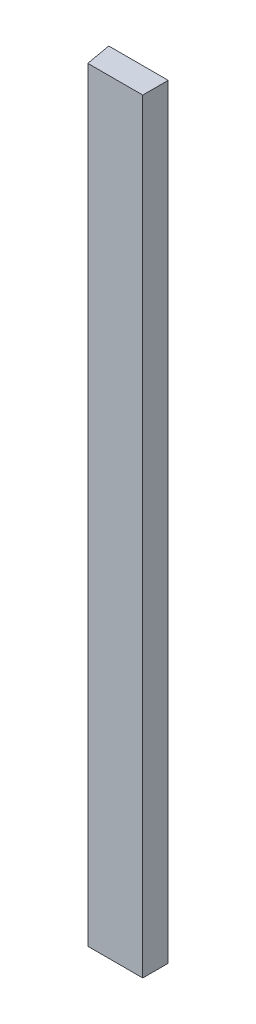
ISO-10303-21;
HEADER;
FILE_DESCRIPTION(('STEP AP214'),'2;1');
FILE_NAME('part.step','',(''),(''),'','','');
FILE_SCHEMA(('AUTOMOTIVE_DESIGN { 1 0 10303 214 1 1 1 1 }'));
ENDSEC;
DATA;
#1=APPLICATION_CONTEXT('core data for automotive mechanical design processes');
#2=APPLICATION_PROTOCOL_DEFINITION('international standard','automotive_design',2000,#1);
#3=PRODUCT_CONTEXT('',#1,'mechanical');
#4=PRODUCT('Part','Part','',(#3));
#5=PRODUCT_RELATED_PRODUCT_CATEGORY('part','',(#4));
#6=PRODUCT_DEFINITION_FORMATION('','',#4);
#7=PRODUCT_DEFINITION_CONTEXT('part definition',#1,'design');
#8=PRODUCT_DEFINITION('design','',#6,#7);
#9=PRODUCT_DEFINITION_SHAPE('','',#8);
#10=(LENGTH_UNIT() NAMED_UNIT(*) SI_UNIT(.MILLI.,.METRE.));
#11=(NAMED_UNIT(*) PLANE_ANGLE_UNIT() SI_UNIT($,.RADIAN.));
#12=(NAMED_UNIT(*) SI_UNIT($,.STERADIAN.) SOLID_ANGLE_UNIT());
#13=UNCERTAINTY_MEASURE_WITH_UNIT(LENGTH_MEASURE(1.E-05),#10,'distance_accuracy_value','');
#14=(GEOMETRIC_REPRESENTATION_CONTEXT(3) GLOBAL_UNCERTAINTY_ASSIGNED_CONTEXT((#13)) GLOBAL_UNIT_ASSIGNED_CONTEXT((#10,
#11,#12)) REPRESENTATION_CONTEXT('',''));
#15=CARTESIAN_POINT('',(0.,0.,0.));
#16=DIRECTION('',(0.,0.,1.));
#17=DIRECTION('',(1.,0.,0.));
#18=AXIS2_PLACEMENT_3D('',#15,#16,#17);
#19=CARTESIAN_POINT('',(44.4500000000001,1143.,-19.05));
#20=DIRECTION('',(-1.,0.,0.));
#21=DIRECTION('',(0.,0.,1.));
#22=AXIS2_PLACEMENT_3D('',#19,#20,#21);
#23=PLANE('',#22);
#24=DIRECTION('',(0.,0.,-1.));
#25=VECTOR('',#24,1.);
#26=CARTESIAN_POINT('',(44.4500000000001,8.88178419700125E-13,-19.0500000000009));
#27=LINE('',#26,#25);
#28=CARTESIAN_POINT('',(44.4500000000001,8.88178419700125E-13,19.0499999999991));
#29=VERTEX_POINT('',#28);
#30=CARTESIAN_POINT('',(44.4500000000001,8.88178419700125E-13,-19.0500000000009));
#31=VERTEX_POINT('',#30);
#32=EDGE_CURVE('E91',#29,#31,#27,.T.);
#33=ORIENTED_EDGE('',*,*,#32,.T.);
#34=DIRECTION('',(0.,-1.,0.));
#35=VECTOR('',#34,1.);
#36=CARTESIAN_POINT('',(44.4500000000001,1143.,-19.05));
#37=LINE('',#36,#35);
#38=CARTESIAN_POINT('',(44.4500000000001,1143.,-19.05));
#39=VERTEX_POINT('',#38);
#40=EDGE_CURVE('E11',#39,#31,#37,.T.);
#41=ORIENTED_EDGE('',*,*,#40,.F.);
#42=DIRECTION('',(0.,0.,-1.));
#43=VECTOR('',#42,1.);
#44=CARTESIAN_POINT('',(44.4500000000001,1143.,-19.05));
#45=LINE('',#44,#43);
#46=CARTESIAN_POINT('',(44.4500000000001,1143.,19.05));
#47=VERTEX_POINT('',#46);
#48=EDGE_CURVE('E79',#47,#39,#45,.T.);
#49=ORIENTED_EDGE('',*,*,#48,.F.);
#50=DIRECTION('',(0.,-1.,0.));
#51=VECTOR('',#50,1.);
#52=CARTESIAN_POINT('',(44.4500000000001,1143.,19.05));
#53=LINE('',#52,#51);
#54=EDGE_CURVE('E87',#47,#29,#53,.T.);
#55=ORIENTED_EDGE('',*,*,#54,.T.);
#56=EDGE_LOOP('',(#33,#41,#49,#55));
#57=FACE_BOUND('',#56,.T.);
#58=ADVANCED_FACE('F28',(#57),#23,.F.);
#59=CARTESIAN_POINT('',(44.4500000000001,1143.,-19.05));
#60=DIRECTION('',(0.,0.,1.));
#61=DIRECTION('',(1.,0.,0.));
#62=AXIS2_PLACEMENT_3D('',#59,#60,#61);
#63=PLANE('',#62);
#64=DIRECTION('',(-1.,0.,0.));
#65=VECTOR('',#64,1.);
#66=CARTESIAN_POINT('',(44.4500000000001,8.88178419700125E-13,-19.0500000000009));
#67=LINE('',#66,#65);
#68=CARTESIAN_POINT('',(-44.4500000000001,0.,-19.05));
#69=VERTEX_POINT('',#68);
#70=EDGE_CURVE('E83',#31,#69,#67,.T.);
#71=ORIENTED_EDGE('',*,*,#70,.T.);
#72=DIRECTION('',(0.,-1.,0.));
#73=VECTOR('',#72,1.);
#74=CARTESIAN_POINT('',(-44.4499999999999,1143.,-19.05));
#75=LINE('',#74,#73);
#76=CARTESIAN_POINT('',(-44.4499999999999,1143.,-19.05));
#77=VERTEX_POINT('',#76);
#78=EDGE_CURVE('E36',#77,#69,#75,.T.);
#79=ORIENTED_EDGE('',*,*,#78,.F.);
#80=DIRECTION('',(-1.,0.,0.));
#81=VECTOR('',#80,1.);
#82=CARTESIAN_POINT('',(44.4500000000001,1143.,-19.05));
#83=LINE('',#82,#81);
#84=EDGE_CURVE('E74',#39,#77,#83,.T.);
#85=ORIENTED_EDGE('',*,*,#84,.F.);
#86=ORIENTED_EDGE('',*,*,#40,.T.);
#87=EDGE_LOOP('',(#71,#79,#85,#86));
#88=FACE_BOUND('',#87,.T.);
#89=ADVANCED_FACE('F82',(#88),#63,.F.);
#90=CARTESIAN_POINT('',(-44.4499999999999,1143.,-19.05));
#91=DIRECTION('',(0.984807753012207,0.,-0.173648177666935));
#92=DIRECTION('',(-0.173648177666935,0.,-0.984807753012207));
#93=AXIS2_PLACEMENT_3D('',#90,#91,#92);
#94=PLANE('',#93);
#95=DIRECTION('',(0.173648177666935,0.,0.984807753012207));
#96=VECTOR('',#95,1.);
#97=CARTESIAN_POINT('',(-44.4500000000001,0.,-19.05));
#98=LINE('',#97,#96);
#99=CARTESIAN_POINT('',(-37.7319420350073,0.,19.05));
#100=VERTEX_POINT('',#99);
#101=EDGE_CURVE('E61',#69,#100,#98,.T.);
#102=ORIENTED_EDGE('',*,*,#101,.T.);
#103=DIRECTION('',(0.,-1.,0.));
#104=VECTOR('',#103,1.);
#105=CARTESIAN_POINT('',(-37.7319420350073,1143.,19.05));
#106=LINE('',#105,#104);
#107=CARTESIAN_POINT('',(-37.7319420350073,1143.,19.05));
#108=VERTEX_POINT('',#107);
#109=EDGE_CURVE('E84',#108,#100,#106,.T.);
#110=ORIENTED_EDGE('',*,*,#109,.F.);
#111=DIRECTION('',(0.173648177666935,0.,0.984807753012207));
#112=VECTOR('',#111,1.);
#113=CARTESIAN_POINT('',(-44.4499999999999,1143.,-19.05));
#114=LINE('',#113,#112);
#115=EDGE_CURVE('E77',#77,#108,#114,.T.);
#116=ORIENTED_EDGE('',*,*,#115,.F.);
#117=ORIENTED_EDGE('',*,*,#78,.T.);
#118=EDGE_LOOP('',(#102,#110,#116,#117));
#119=FACE_BOUND('',#118,.T.);
#120=ADVANCED_FACE('F85',(#119),#94,.F.);
#121=CARTESIAN_POINT('',(44.4500000000001,1143.,19.05));
#122=DIRECTION('',(0.,0.,-1.));
#123=DIRECTION('',(-1.,0.,0.));
#124=AXIS2_PLACEMENT_3D('',#121,#122,#123);
#125=PLANE('',#124);
#126=DIRECTION('',(1.,0.,0.));
#127=VECTOR('',#126,1.);
#128=CARTESIAN_POINT('',(44.4500000000001,8.88178419700125E-13,19.0499999999991));
#129=LINE('',#128,#127);
#130=EDGE_CURVE('E67',#100,#29,#129,.T.);
#131=ORIENTED_EDGE('',*,*,#130,.T.);
#132=ORIENTED_EDGE('',*,*,#54,.F.);
#133=DIRECTION('',(1.,0.,0.));
#134=VECTOR('',#133,1.);
#135=CARTESIAN_POINT('',(44.4500000000001,1143.,19.05));
#136=LINE('',#135,#134);
#137=EDGE_CURVE('E44',#108,#47,#136,.T.);
#138=ORIENTED_EDGE('',*,*,#137,.F.);
#139=ORIENTED_EDGE('',*,*,#109,.T.);
#140=EDGE_LOOP('',(#131,#132,#138,#139));
#141=FACE_BOUND('',#140,.T.);
#142=ADVANCED_FACE('F98',(#141),#125,.F.);
#143=CARTESIAN_POINT('',(0.,1143.,0.));
#144=DIRECTION('',(0.,-1.,0.));
#145=DIRECTION('',(0.,0.,-1.));
#146=AXIS2_PLACEMENT_3D('',#143,#144,#145);
#147=PLANE('',#146);
#148=ORIENTED_EDGE('',*,*,#48,.T.);
#149=ORIENTED_EDGE('',*,*,#84,.T.);
#150=ORIENTED_EDGE('',*,*,#115,.T.);
#151=ORIENTED_EDGE('',*,*,#137,.T.);
#152=EDGE_LOOP('',(#148,#149,#150,#151));
#153=FACE_BOUND('',#152,.T.);
#154=ADVANCED_FACE('F75',(#153),#147,.F.);
#155=CARTESIAN_POINT('',(0.,0.,0.));
#156=DIRECTION('',(0.,-1.,0.));
#157=DIRECTION('',(0.,0.,-1.));
#158=AXIS2_PLACEMENT_3D('',#155,#156,#157);
#159=PLANE('',#158);
#160=ORIENTED_EDGE('',*,*,#32,.F.);
#161=ORIENTED_EDGE('',*,*,#130,.F.);
#162=ORIENTED_EDGE('',*,*,#101,.F.);
#163=ORIENTED_EDGE('',*,*,#70,.F.);
#164=EDGE_LOOP('',(#160,#161,#162,#163));
#165=FACE_BOUND('',#164,.T.);
#166=ADVANCED_FACE('F101',(#165),#159,.T.);
#167=CLOSED_SHELL('',(#58,#89,#120,#142,#154,#166));
#168=MANIFOLD_SOLID_BREP('B2',#167);
#169=ADVANCED_BREP_SHAPE_REPRESENTATION('',(#18,#168),#14);
#170=SHAPE_DEFINITION_REPRESENTATION(#9,#169);
ENDSEC;
END-ISO-10303-21;
